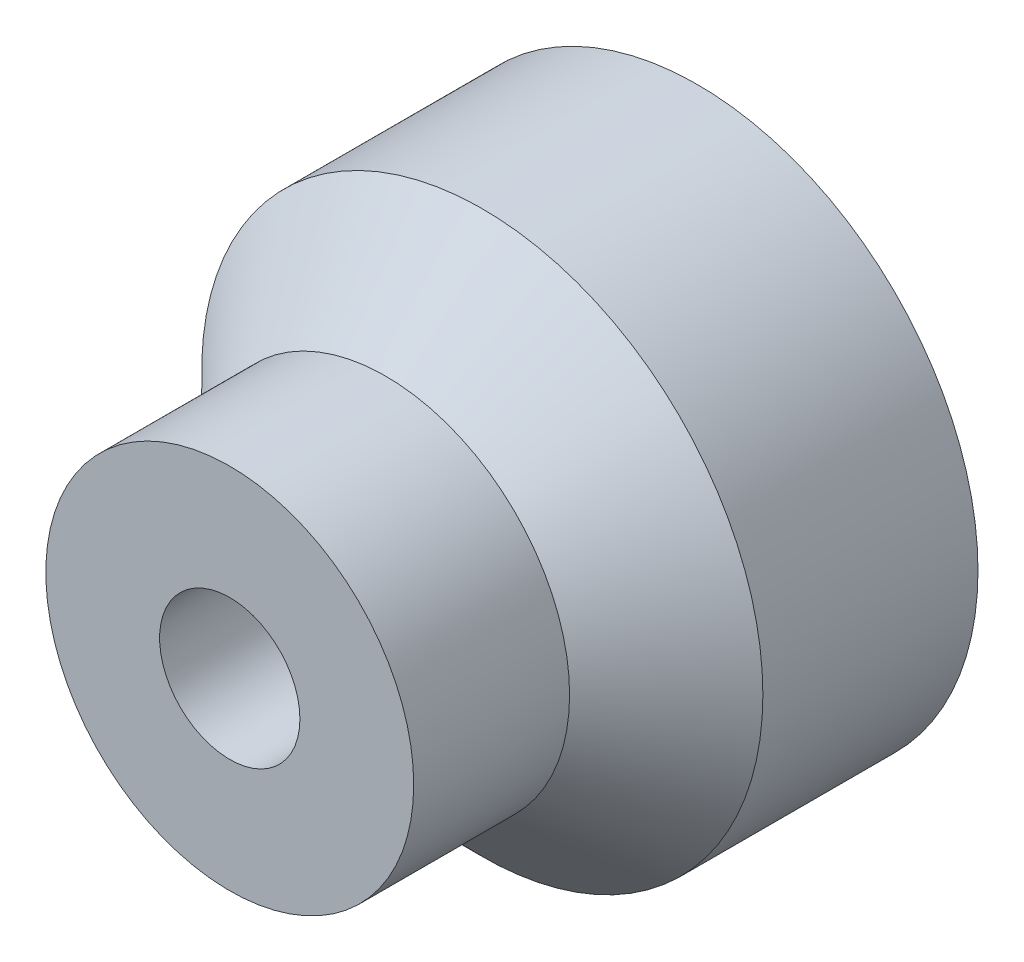
ISO-10303-21;
HEADER;
FILE_DESCRIPTION(('STEP AP214'),'2;1');
FILE_NAME('part.step','',(''),(''),'','','');
FILE_SCHEMA(('AUTOMOTIVE_DESIGN { 1 0 10303 214 1 1 1 1 }'));
ENDSEC;
DATA;
#1=APPLICATION_CONTEXT('core data for automotive mechanical design processes');
#2=APPLICATION_PROTOCOL_DEFINITION('international standard','automotive_design',2000,#1);
#3=PRODUCT_CONTEXT('',#1,'mechanical');
#4=PRODUCT('Part','Part','',(#3));
#5=PRODUCT_RELATED_PRODUCT_CATEGORY('part','',(#4));
#6=PRODUCT_DEFINITION_FORMATION('','',#4);
#7=PRODUCT_DEFINITION_CONTEXT('part definition',#1,'design');
#8=PRODUCT_DEFINITION('design','',#6,#7);
#9=PRODUCT_DEFINITION_SHAPE('','',#8);
#10=(LENGTH_UNIT() NAMED_UNIT(*) SI_UNIT(.MILLI.,.METRE.));
#11=(NAMED_UNIT(*) PLANE_ANGLE_UNIT() SI_UNIT($,.RADIAN.));
#12=(NAMED_UNIT(*) SI_UNIT($,.STERADIAN.) SOLID_ANGLE_UNIT());
#13=UNCERTAINTY_MEASURE_WITH_UNIT(LENGTH_MEASURE(1.E-05),#10,'distance_accuracy_value','');
#14=(GEOMETRIC_REPRESENTATION_CONTEXT(3) GLOBAL_UNCERTAINTY_ASSIGNED_CONTEXT((#13)) GLOBAL_UNIT_ASSIGNED_CONTEXT((#10,
#11,#12)) REPRESENTATION_CONTEXT('',''));
#15=CARTESIAN_POINT('',(0.,0.,0.));
#16=DIRECTION('',(0.,0.,1.));
#17=DIRECTION('',(1.,0.,0.));
#18=AXIS2_PLACEMENT_3D('',#15,#16,#17);
#19=CARTESIAN_POINT('',(0.,0.,0.));
#20=DIRECTION('',(0.,0.,1.));
#21=DIRECTION('',(1.,0.,0.));
#22=AXIS2_PLACEMENT_3D('',#19,#20,#21);
#23=CYLINDRICAL_SURFACE('',#22,2.25);
#24=CARTESIAN_POINT('',(0.,0.,0.));
#25=DIRECTION('',(0.,0.,1.));
#26=DIRECTION('',(1.,0.,0.));
#27=AXIS2_PLACEMENT_3D('',#24,#25,#26);
#28=CIRCLE('',#27,2.25);
#29=CARTESIAN_POINT('',(2.25,0.,0.));
#30=VERTEX_POINT('',#29);
#31=EDGE_CURVE('E10',#30,#30,#28,.T.);
#32=ORIENTED_EDGE('',*,*,#31,.T.);
#33=EDGE_LOOP('',(#32));
#34=FACE_BOUND('',#33,.T.);
#35=CARTESIAN_POINT('',(0.,0.,-10.));
#36=DIRECTION('',(0.,0.,1.));
#37=DIRECTION('',(1.,0.,0.));
#38=AXIS2_PLACEMENT_3D('',#35,#36,#37);
#39=CIRCLE('',#38,2.25);
#40=CARTESIAN_POINT('',(2.25,0.,-10.));
#41=VERTEX_POINT('',#40);
#42=EDGE_CURVE('E65',#41,#41,#39,.T.);
#43=ORIENTED_EDGE('',*,*,#42,.F.);
#44=EDGE_LOOP('',(#43));
#45=FACE_BOUND('',#44,.T.);
#46=ADVANCED_FACE('F37',(#34,#45),#23,.F.);
#47=CARTESIAN_POINT('',(2.25,0.,0.));
#48=DIRECTION('',(0.,0.,1.));
#49=DIRECTION('',(1.,0.,0.));
#50=AXIS2_PLACEMENT_3D('',#47,#48,#49);
#51=PLANE('',#50);
#52=CARTESIAN_POINT('',(0.,0.,0.));
#53=DIRECTION('',(0.,0.,1.));
#54=DIRECTION('',(1.,0.,0.));
#55=AXIS2_PLACEMENT_3D('',#52,#53,#54);
#56=CIRCLE('',#55,5.9);
#57=CARTESIAN_POINT('',(5.9,0.,0.));
#58=VERTEX_POINT('',#57);
#59=EDGE_CURVE('E43',#58,#58,#56,.T.);
#60=ORIENTED_EDGE('',*,*,#59,.T.);
#61=EDGE_LOOP('',(#60));
#62=FACE_BOUND('',#61,.T.);
#63=ORIENTED_EDGE('',*,*,#31,.F.);
#64=EDGE_LOOP('',(#63));
#65=FACE_BOUND('',#64,.T.);
#66=ADVANCED_FACE('F73',(#62,#65),#51,.T.);
#67=CARTESIAN_POINT('',(0.,0.,0.));
#68=DIRECTION('',(0.,0.,1.));
#69=DIRECTION('',(1.,0.,0.));
#70=AXIS2_PLACEMENT_3D('',#67,#68,#69);
#71=CYLINDRICAL_SURFACE('',#70,5.9);
#72=CARTESIAN_POINT('',(0.,0.,-5.));
#73=DIRECTION('',(0.,0.,1.));
#74=DIRECTION('',(1.,0.,0.));
#75=AXIS2_PLACEMENT_3D('',#72,#73,#74);
#76=CIRCLE('',#75,5.9);
#77=CARTESIAN_POINT('',(5.9,0.,-5.));
#78=VERTEX_POINT('',#77);
#79=EDGE_CURVE('E47',#78,#78,#76,.T.);
#80=ORIENTED_EDGE('',*,*,#79,.T.);
#81=EDGE_LOOP('',(#80));
#82=FACE_BOUND('',#81,.T.);
#83=ORIENTED_EDGE('',*,*,#59,.F.);
#84=EDGE_LOOP('',(#83));
#85=FACE_BOUND('',#84,.T.);
#86=ADVANCED_FACE('F77',(#82,#85),#71,.T.);
#87=CARTESIAN_POINT('',(0.,0.,-5.));
#88=DIRECTION('',(0.,0.,-1.));
#89=DIRECTION('',(-1.,0.,0.));
#90=AXIS2_PLACEMENT_3D('',#87,#88,#89);
#91=CONICAL_SURFACE('',#90,5.9,0.78539816339745);
#92=CARTESIAN_POINT('',(0.,0.,-8.09999999999999));
#93=DIRECTION('',(0.,0.,1.));
#94=DIRECTION('',(1.,0.,0.));
#95=AXIS2_PLACEMENT_3D('',#92,#93,#94);
#96=CIRCLE('',#95,9.);
#97=CARTESIAN_POINT('',(9.,0.,-8.09999999999999));
#98=VERTEX_POINT('',#97);
#99=EDGE_CURVE('E51',#98,#98,#96,.T.);
#100=ORIENTED_EDGE('',*,*,#99,.T.);
#101=EDGE_LOOP('',(#100));
#102=FACE_BOUND('',#101,.T.);
#103=ORIENTED_EDGE('',*,*,#79,.F.);
#104=EDGE_LOOP('',(#103));
#105=FACE_BOUND('',#104,.T.);
#106=ADVANCED_FACE('F81',(#102,#105),#91,.T.);
#107=CARTESIAN_POINT('',(0.,0.,0.));
#108=DIRECTION('',(0.,0.,1.));
#109=DIRECTION('',(1.,0.,0.));
#110=AXIS2_PLACEMENT_3D('',#107,#108,#109);
#111=CYLINDRICAL_SURFACE('',#110,9.);
#112=CARTESIAN_POINT('',(0.,0.,-15.));
#113=DIRECTION('',(0.,0.,1.));
#114=DIRECTION('',(1.,0.,0.));
#115=AXIS2_PLACEMENT_3D('',#112,#113,#114);
#116=CIRCLE('',#115,9.);
#117=CARTESIAN_POINT('',(9.,0.,-15.));
#118=VERTEX_POINT('',#117);
#119=EDGE_CURVE('E56',#118,#118,#116,.T.);
#120=ORIENTED_EDGE('',*,*,#119,.T.);
#121=EDGE_LOOP('',(#120));
#122=FACE_BOUND('',#121,.T.);
#123=ORIENTED_EDGE('',*,*,#99,.F.);
#124=EDGE_LOOP('',(#123));
#125=FACE_BOUND('',#124,.T.);
#126=ADVANCED_FACE('F88',(#122,#125),#111,.T.);
#127=CARTESIAN_POINT('',(9.,0.,-15.));
#128=DIRECTION('',(0.,0.,-1.));
#129=DIRECTION('',(-1.,0.,0.));
#130=AXIS2_PLACEMENT_3D('',#127,#128,#129);
#131=PLANE('',#130);
#132=CARTESIAN_POINT('',(0.,0.,-15.));
#133=DIRECTION('',(0.,0.,1.));
#134=DIRECTION('',(1.,0.,0.));
#135=AXIS2_PLACEMENT_3D('',#132,#133,#134);
#136=CIRCLE('',#135,6.);
#137=CARTESIAN_POINT('',(6.,0.,-15.));
#138=VERTEX_POINT('',#137);
#139=EDGE_CURVE('E59',#138,#138,#136,.T.);
#140=ORIENTED_EDGE('',*,*,#139,.T.);
#141=EDGE_LOOP('',(#140));
#142=FACE_BOUND('',#141,.T.);
#143=ORIENTED_EDGE('',*,*,#119,.F.);
#144=EDGE_LOOP('',(#143));
#145=FACE_BOUND('',#144,.T.);
#146=ADVANCED_FACE('F92',(#142,#145),#131,.T.);
#147=CARTESIAN_POINT('',(0.,0.,0.));
#148=DIRECTION('',(0.,0.,1.));
#149=DIRECTION('',(1.,0.,0.));
#150=AXIS2_PLACEMENT_3D('',#147,#148,#149);
#151=CYLINDRICAL_SURFACE('',#150,6.);
#152=CARTESIAN_POINT('',(0.,0.,-10.));
#153=DIRECTION('',(0.,0.,1.));
#154=DIRECTION('',(1.,0.,0.));
#155=AXIS2_PLACEMENT_3D('',#152,#153,#154);
#156=CIRCLE('',#155,6.);
#157=CARTESIAN_POINT('',(6.,0.,-10.));
#158=VERTEX_POINT('',#157);
#159=EDGE_CURVE('E62',#158,#158,#156,.T.);
#160=ORIENTED_EDGE('',*,*,#159,.T.);
#161=EDGE_LOOP('',(#160));
#162=FACE_BOUND('',#161,.T.);
#163=ORIENTED_EDGE('',*,*,#139,.F.);
#164=EDGE_LOOP('',(#163));
#165=FACE_BOUND('',#164,.T.);
#166=ADVANCED_FACE('F96',(#162,#165),#151,.F.);
#167=CARTESIAN_POINT('',(6.,0.,-10.));
#168=DIRECTION('',(0.,0.,-1.));
#169=DIRECTION('',(-1.,0.,0.));
#170=AXIS2_PLACEMENT_3D('',#167,#168,#169);
#171=PLANE('',#170);
#172=ORIENTED_EDGE('',*,*,#42,.T.);
#173=EDGE_LOOP('',(#172));
#174=FACE_BOUND('',#173,.T.);
#175=ORIENTED_EDGE('',*,*,#159,.F.);
#176=EDGE_LOOP('',(#175));
#177=FACE_BOUND('',#176,.T.);
#178=ADVANCED_FACE('F69',(#174,#177),#171,.T.);
#179=CLOSED_SHELL('',(#46,#66,#86,#106,#126,#146,#166,#178));
#180=MANIFOLD_SOLID_BREP('B2',#179);
#181=ADVANCED_BREP_SHAPE_REPRESENTATION('',(#18,#180),#14);
#182=SHAPE_DEFINITION_REPRESENTATION(#9,#181);
ENDSEC;
END-ISO-10303-21;
